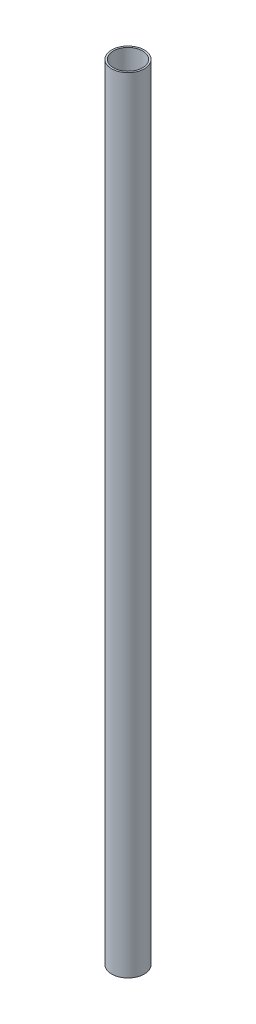
ISO-10303-21;
HEADER;
FILE_DESCRIPTION(('STEP AP214'),'2;1');
FILE_NAME('part.step','',(''),(''),'','','');
FILE_SCHEMA(('AUTOMOTIVE_DESIGN { 1 0 10303 214 1 1 1 1 }'));
ENDSEC;
DATA;
#1=APPLICATION_CONTEXT('core data for automotive mechanical design processes');
#2=APPLICATION_PROTOCOL_DEFINITION('international standard','automotive_design',2000,#1);
#3=PRODUCT_CONTEXT('',#1,'mechanical');
#4=PRODUCT('Part','Part','',(#3));
#5=PRODUCT_RELATED_PRODUCT_CATEGORY('part','',(#4));
#6=PRODUCT_DEFINITION_FORMATION('','',#4);
#7=PRODUCT_DEFINITION_CONTEXT('part definition',#1,'design');
#8=PRODUCT_DEFINITION('design','',#6,#7);
#9=PRODUCT_DEFINITION_SHAPE('','',#8);
#10=(LENGTH_UNIT() NAMED_UNIT(*) SI_UNIT(.MILLI.,.METRE.));
#11=(NAMED_UNIT(*) PLANE_ANGLE_UNIT() SI_UNIT($,.RADIAN.));
#12=(NAMED_UNIT(*) SI_UNIT($,.STERADIAN.) SOLID_ANGLE_UNIT());
#13=UNCERTAINTY_MEASURE_WITH_UNIT(LENGTH_MEASURE(1.E-05),#10,'distance_accuracy_value','');
#14=(GEOMETRIC_REPRESENTATION_CONTEXT(3) GLOBAL_UNCERTAINTY_ASSIGNED_CONTEXT((#13)) GLOBAL_UNIT_ASSIGNED_CONTEXT((#10,
#11,#12)) REPRESENTATION_CONTEXT('',''));
#15=CARTESIAN_POINT('',(0.,0.,0.));
#16=DIRECTION('',(0.,0.,1.));
#17=DIRECTION('',(1.,0.,0.));
#18=AXIS2_PLACEMENT_3D('',#15,#16,#17);
#19=CARTESIAN_POINT('',(0.,2743.2,0.));
#20=DIRECTION('',(0.,1.,0.));
#21=DIRECTION('',(0.,0.,1.));
#22=AXIS2_PLACEMENT_3D('',#19,#20,#21);
#23=PLANE('',#22);
#24=CARTESIAN_POINT('',(0.,2743.2,0.));
#25=DIRECTION('',(0.,1.,0.));
#26=DIRECTION('',(0.,0.,1.));
#27=AXIS2_PLACEMENT_3D('',#24,#25,#26);
#28=CIRCLE('',#27,57.15);
#29=CARTESIAN_POINT('',(0.,2743.2,57.15));
#30=VERTEX_POINT('',#29);
#31=EDGE_CURVE('E10',#30,#30,#28,.T.);
#32=ORIENTED_EDGE('',*,*,#31,.T.);
#33=EDGE_LOOP('',(#32));
#34=FACE_BOUND('',#33,.T.);
#35=CARTESIAN_POINT('',(0.,2743.2,0.));
#36=DIRECTION('',(0.,1.,0.));
#37=DIRECTION('',(0.,0.,1.));
#38=AXIS2_PLACEMENT_3D('',#35,#36,#37);
#39=CIRCLE('',#38,51.1302);
#40=CARTESIAN_POINT('',(0.,2743.2,51.1302));
#41=VERTEX_POINT('',#40);
#42=EDGE_CURVE('E54',#41,#41,#39,.T.);
#43=ORIENTED_EDGE('',*,*,#42,.F.);
#44=EDGE_LOOP('',(#43));
#45=FACE_BOUND('',#44,.T.);
#46=ADVANCED_FACE('F41',(#34,#45),#23,.T.);
#47=CARTESIAN_POINT('',(0.,0.,0.));
#48=DIRECTION('',(0.,1.,0.));
#49=DIRECTION('',(0.,0.,1.));
#50=AXIS2_PLACEMENT_3D('',#47,#48,#49);
#51=PLANE('',#50);
#52=CARTESIAN_POINT('',(0.,0.,0.));
#53=DIRECTION('',(0.,1.,0.));
#54=DIRECTION('',(0.,0.,1.));
#55=AXIS2_PLACEMENT_3D('',#52,#53,#54);
#56=CIRCLE('',#55,57.15);
#57=CARTESIAN_POINT('',(0.,0.,57.15));
#58=VERTEX_POINT('',#57);
#59=EDGE_CURVE('E45',#58,#58,#56,.T.);
#60=ORIENTED_EDGE('',*,*,#59,.F.);
#61=EDGE_LOOP('',(#60));
#62=FACE_BOUND('',#61,.T.);
#63=CARTESIAN_POINT('',(0.,0.,0.));
#64=DIRECTION('',(0.,1.,0.));
#65=DIRECTION('',(0.,0.,1.));
#66=AXIS2_PLACEMENT_3D('',#63,#64,#65);
#67=CIRCLE('',#66,51.1302);
#68=CARTESIAN_POINT('',(0.,0.,51.1302));
#69=VERTEX_POINT('',#68);
#70=EDGE_CURVE('E56',#69,#69,#67,.T.);
#71=ORIENTED_EDGE('',*,*,#70,.T.);
#72=EDGE_LOOP('',(#71));
#73=FACE_BOUND('',#72,.T.);
#74=ADVANCED_FACE('F68',(#62,#73),#51,.F.);
#75=CARTESIAN_POINT('',(0.,2743.2,0.));
#76=DIRECTION('',(0.,-1.,0.));
#77=DIRECTION('',(0.,0.,-1.));
#78=AXIS2_PLACEMENT_3D('',#75,#76,#77);
#79=CYLINDRICAL_SURFACE('',#78,57.15);
#80=ORIENTED_EDGE('',*,*,#31,.F.);
#81=EDGE_LOOP('',(#80));
#82=FACE_BOUND('',#81,.T.);
#83=ORIENTED_EDGE('',*,*,#59,.T.);
#84=EDGE_LOOP('',(#83));
#85=FACE_BOUND('',#84,.T.);
#86=ADVANCED_FACE('F43',(#82,#85),#79,.T.);
#87=CARTESIAN_POINT('',(0.,2743.2,0.));
#88=DIRECTION('',(0.,-1.,0.));
#89=DIRECTION('',(0.,0.,-1.));
#90=AXIS2_PLACEMENT_3D('',#87,#88,#89);
#91=CYLINDRICAL_SURFACE('',#90,51.1302);
#92=ORIENTED_EDGE('',*,*,#42,.T.);
#93=EDGE_LOOP('',(#92));
#94=FACE_BOUND('',#93,.T.);
#95=ORIENTED_EDGE('',*,*,#70,.F.);
#96=EDGE_LOOP('',(#95));
#97=FACE_BOUND('',#96,.T.);
#98=ADVANCED_FACE('F64',(#94,#97),#91,.F.);
#99=CLOSED_SHELL('',(#46,#74,#86,#98));
#100=MANIFOLD_SOLID_BREP('B2',#99);
#101=ADVANCED_BREP_SHAPE_REPRESENTATION('',(#18,#100),#14);
#102=SHAPE_DEFINITION_REPRESENTATION(#9,#101);
ENDSEC;
END-ISO-10303-21;
